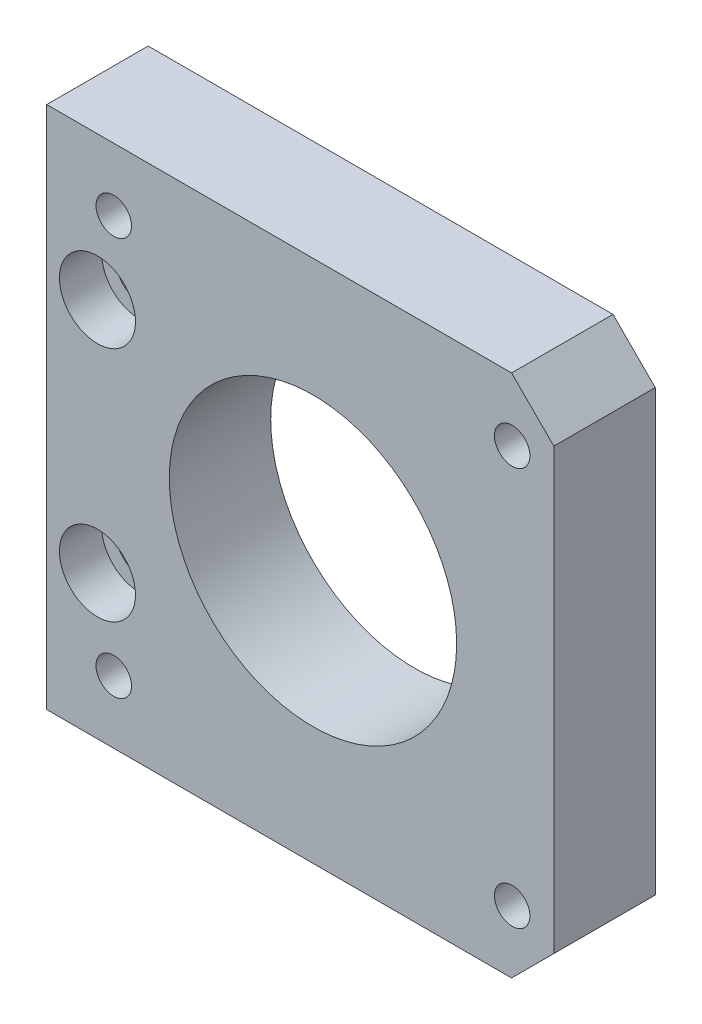
ISO-10303-21;
HEADER;
FILE_DESCRIPTION(('STEP AP214'),'2;1');
FILE_NAME('part.step','',(''),(''),'','','');
FILE_SCHEMA(('AUTOMOTIVE_DESIGN { 1 0 10303 214 1 1 1 1 }'));
ENDSEC;
DATA;
#1=APPLICATION_CONTEXT('core data for automotive mechanical design processes');
#2=APPLICATION_PROTOCOL_DEFINITION('international standard','automotive_design',2000,#1);
#3=PRODUCT_CONTEXT('',#1,'mechanical');
#4=PRODUCT('Part','Part','',(#3));
#5=PRODUCT_RELATED_PRODUCT_CATEGORY('part','',(#4));
#6=PRODUCT_DEFINITION_FORMATION('','',#4);
#7=PRODUCT_DEFINITION_CONTEXT('part definition',#1,'design');
#8=PRODUCT_DEFINITION('design','',#6,#7);
#9=PRODUCT_DEFINITION_SHAPE('','',#8);
#10=(LENGTH_UNIT() NAMED_UNIT(*) SI_UNIT(.MILLI.,.METRE.));
#11=(NAMED_UNIT(*) PLANE_ANGLE_UNIT() SI_UNIT($,.RADIAN.));
#12=(NAMED_UNIT(*) SI_UNIT($,.STERADIAN.) SOLID_ANGLE_UNIT());
#13=UNCERTAINTY_MEASURE_WITH_UNIT(LENGTH_MEASURE(1.E-05),#10,'distance_accuracy_value','');
#14=(GEOMETRIC_REPRESENTATION_CONTEXT(3) GLOBAL_UNCERTAINTY_ASSIGNED_CONTEXT((#13)) GLOBAL_UNIT_ASSIGNED_CONTEXT((#10,
#11,#12)) REPRESENTATION_CONTEXT('',''));
#15=CARTESIAN_POINT('',(0.,0.,0.));
#16=DIRECTION('',(0.,0.,1.));
#17=DIRECTION('',(1.,0.,0.));
#18=AXIS2_PLACEMENT_3D('',#15,#16,#17);
#19=CARTESIAN_POINT('',(0.,269.,12.));
#20=DIRECTION('',(1.,0.,0.));
#21=DIRECTION('',(0.,1.,0.));
#22=AXIS2_PLACEMENT_3D('',#19,#20,#21);
#23=PLANE('',#22);
#24=DIRECTION('',(0.,-1.,0.));
#25=VECTOR('',#24,1.);
#26=CARTESIAN_POINT('',(0.,269.,0.));
#27=LINE('',#26,#25);
#28=CARTESIAN_POINT('',(0.,331.,0.));
#29=VERTEX_POINT('',#28);
#30=CARTESIAN_POINT('',(0.,269.,0.));
#31=VERTEX_POINT('',#30);
#32=EDGE_CURVE('E105',#29,#31,#27,.T.);
#33=ORIENTED_EDGE('',*,*,#32,.T.);
#34=DIRECTION('',(0.,0.,-1.));
#35=VECTOR('',#34,1.);
#36=CARTESIAN_POINT('',(0.,269.,12.));
#37=LINE('',#36,#35);
#38=CARTESIAN_POINT('',(0.,269.,12.));
#39=VERTEX_POINT('',#38);
#40=EDGE_CURVE('E90',#39,#31,#37,.T.);
#41=ORIENTED_EDGE('',*,*,#40,.F.);
#42=DIRECTION('',(0.,-1.,0.));
#43=VECTOR('',#42,1.);
#44=CARTESIAN_POINT('',(0.,269.,12.));
#45=LINE('',#44,#43);
#46=CARTESIAN_POINT('',(0.,331.,12.));
#47=VERTEX_POINT('',#46);
#48=EDGE_CURVE('E94',#47,#39,#45,.T.);
#49=ORIENTED_EDGE('',*,*,#48,.F.);
#50=DIRECTION('',(0.,0.,-1.));
#51=VECTOR('',#50,1.);
#52=CARTESIAN_POINT('',(0.,331.,12.));
#53=LINE('',#52,#51);
#54=EDGE_CURVE('E107',#47,#29,#53,.T.);
#55=ORIENTED_EDGE('',*,*,#54,.T.);
#56=EDGE_LOOP('',(#33,#41,#49,#55));
#57=FACE_BOUND('',#56,.T.);
#58=ADVANCED_FACE('F33',(#57),#23,.F.);
#59=CARTESIAN_POINT('',(0.,269.,12.));
#60=DIRECTION('',(0.,1.,0.));
#61=DIRECTION('',(0.,0.,1.));
#62=AXIS2_PLACEMENT_3D('',#59,#60,#61);
#63=PLANE('',#62);
#64=DIRECTION('',(1.,0.,0.));
#65=VECTOR('',#64,1.);
#66=CARTESIAN_POINT('',(0.,269.,0.));
#67=LINE('',#66,#65);
#68=CARTESIAN_POINT('',(55.,269.,0.));
#69=VERTEX_POINT('',#68);
#70=EDGE_CURVE('E133',#31,#69,#67,.T.);
#71=ORIENTED_EDGE('',*,*,#70,.T.);
#72=DIRECTION('',(0.,0.,1.));
#73=VECTOR('',#72,1.);
#74=CARTESIAN_POINT('',(55.,269.,12.));
#75=LINE('',#74,#73);
#76=CARTESIAN_POINT('',(55.,269.,12.));
#77=VERTEX_POINT('',#76);
#78=EDGE_CURVE('E56',#69,#77,#75,.T.);
#79=ORIENTED_EDGE('',*,*,#78,.T.);
#80=DIRECTION('',(1.,0.,0.));
#81=VECTOR('',#80,1.);
#82=CARTESIAN_POINT('',(0.,269.,12.));
#83=LINE('',#82,#81);
#84=EDGE_CURVE('E86',#39,#77,#83,.T.);
#85=ORIENTED_EDGE('',*,*,#84,.F.);
#86=ORIENTED_EDGE('',*,*,#40,.T.);
#87=EDGE_LOOP('',(#71,#79,#85,#86));
#88=FACE_BOUND('',#87,.T.);
#89=ADVANCED_FACE('F88',(#88),#63,.F.);
#90=CARTESIAN_POINT('',(60.,269.,12.));
#91=DIRECTION('',(-1.,0.,0.));
#92=DIRECTION('',(0.,0.,1.));
#93=AXIS2_PLACEMENT_3D('',#90,#91,#92);
#94=PLANE('',#93);
#95=DIRECTION('',(0.,1.,0.));
#96=VECTOR('',#95,1.);
#97=CARTESIAN_POINT('',(60.,269.,12.));
#98=LINE('',#97,#96);
#99=CARTESIAN_POINT('',(60.,274.,12.));
#100=VERTEX_POINT('',#99);
#101=CARTESIAN_POINT('',(60.,326.,12.));
#102=VERTEX_POINT('',#101);
#103=EDGE_CURVE('E93',#100,#102,#98,.T.);
#104=ORIENTED_EDGE('',*,*,#103,.F.);
#105=DIRECTION('',(0.,0.,-1.));
#106=VECTOR('',#105,1.);
#107=CARTESIAN_POINT('',(60.,274.,12.));
#108=LINE('',#107,#106);
#109=CARTESIAN_POINT('',(60.,274.,0.));
#110=VERTEX_POINT('',#109);
#111=EDGE_CURVE('E109',#100,#110,#108,.T.);
#112=ORIENTED_EDGE('',*,*,#111,.T.);
#113=DIRECTION('',(0.,1.,0.));
#114=VECTOR('',#113,1.);
#115=CARTESIAN_POINT('',(60.,269.,0.));
#116=LINE('',#115,#114);
#117=CARTESIAN_POINT('',(60.,326.,0.));
#118=VERTEX_POINT('',#117);
#119=EDGE_CURVE('E134',#110,#118,#116,.T.);
#120=ORIENTED_EDGE('',*,*,#119,.T.);
#121=DIRECTION('',(0.,0.,1.));
#122=VECTOR('',#121,1.);
#123=CARTESIAN_POINT('',(60.,326.,12.));
#124=LINE('',#123,#122);
#125=EDGE_CURVE('E106',#118,#102,#124,.T.);
#126=ORIENTED_EDGE('',*,*,#125,.T.);
#127=EDGE_LOOP('',(#104,#112,#120,#126));
#128=FACE_BOUND('',#127,.T.);
#129=ADVANCED_FACE('F125',(#128),#94,.F.);
#130=CARTESIAN_POINT('',(0.,331.,12.));
#131=DIRECTION('',(0.,-1.,0.));
#132=DIRECTION('',(0.,0.,-1.));
#133=AXIS2_PLACEMENT_3D('',#130,#131,#132);
#134=PLANE('',#133);
#135=DIRECTION('',(-1.,0.,0.));
#136=VECTOR('',#135,1.);
#137=CARTESIAN_POINT('',(0.,331.,12.));
#138=LINE('',#137,#136);
#139=CARTESIAN_POINT('',(55.,331.,12.));
#140=VERTEX_POINT('',#139);
#141=EDGE_CURVE('E98',#140,#47,#138,.T.);
#142=ORIENTED_EDGE('',*,*,#141,.F.);
#143=DIRECTION('',(0.,0.,-1.));
#144=VECTOR('',#143,1.);
#145=CARTESIAN_POINT('',(55.,331.,12.));
#146=LINE('',#145,#144);
#147=CARTESIAN_POINT('',(55.,331.,0.));
#148=VERTEX_POINT('',#147);
#149=EDGE_CURVE('E11',#140,#148,#146,.T.);
#150=ORIENTED_EDGE('',*,*,#149,.T.);
#151=DIRECTION('',(-1.,0.,0.));
#152=VECTOR('',#151,1.);
#153=CARTESIAN_POINT('',(0.,331.,0.));
#154=LINE('',#153,#152);
#155=EDGE_CURVE('E102',#148,#29,#154,.T.);
#156=ORIENTED_EDGE('',*,*,#155,.T.);
#157=ORIENTED_EDGE('',*,*,#54,.F.);
#158=EDGE_LOOP('',(#142,#150,#156,#157));
#159=FACE_BOUND('',#158,.T.);
#160=ADVANCED_FACE('F142',(#159),#134,.F.);
#161=CARTESIAN_POINT('',(0.,0.,12.));
#162=DIRECTION('',(0.,0.,-1.));
#163=DIRECTION('',(-1.,0.,0.));
#164=AXIS2_PLACEMENT_3D('',#161,#162,#163);
#165=PLANE('',#164);
#166=CARTESIAN_POINT('',(55.07,323.57,12.));
#167=DIRECTION('',(0.,0.,1.));
#168=DIRECTION('',(1.,0.,0.));
#169=AXIS2_PLACEMENT_3D('',#166,#167,#168);
#170=CIRCLE('',#169,2.09999999999998);
#171=CARTESIAN_POINT('',(57.17,323.57,12.));
#172=VERTEX_POINT('',#171);
#173=EDGE_CURVE('E217',#172,#172,#170,.T.);
#174=ORIENTED_EDGE('',*,*,#173,.F.);
#175=EDGE_LOOP('',(#174));
#176=FACE_BOUND('',#175,.T.);
#177=CARTESIAN_POINT('',(55.07,276.43,12.));
#178=DIRECTION('',(0.,0.,1.));
#179=DIRECTION('',(1.,0.,0.));
#180=AXIS2_PLACEMENT_3D('',#177,#178,#179);
#181=CIRCLE('',#180,2.09999999999998);
#182=CARTESIAN_POINT('',(57.17,276.43,12.));
#183=VERTEX_POINT('',#182);
#184=EDGE_CURVE('E219',#183,#183,#181,.T.);
#185=ORIENTED_EDGE('',*,*,#184,.F.);
#186=EDGE_LOOP('',(#185));
#187=FACE_BOUND('',#186,.T.);
#188=CARTESIAN_POINT('',(7.93000000000001,323.57,12.));
#189=DIRECTION('',(0.,0.,1.));
#190=DIRECTION('',(1.,0.,0.));
#191=AXIS2_PLACEMENT_3D('',#188,#189,#190);
#192=CIRCLE('',#191,2.09999999999999);
#193=CARTESIAN_POINT('',(10.03,323.57,12.));
#194=VERTEX_POINT('',#193);
#195=EDGE_CURVE('E227',#194,#194,#192,.T.);
#196=ORIENTED_EDGE('',*,*,#195,.F.);
#197=EDGE_LOOP('',(#196));
#198=FACE_BOUND('',#197,.T.);
#199=CARTESIAN_POINT('',(7.93,276.43,12.));
#200=DIRECTION('',(0.,0.,1.));
#201=DIRECTION('',(1.,0.,0.));
#202=AXIS2_PLACEMENT_3D('',#199,#200,#201);
#203=CIRCLE('',#202,2.09999999999999);
#204=CARTESIAN_POINT('',(10.03,276.43,12.));
#205=VERTEX_POINT('',#204);
#206=EDGE_CURVE('E233',#205,#205,#203,.T.);
#207=ORIENTED_EDGE('',*,*,#206,.F.);
#208=EDGE_LOOP('',(#207));
#209=FACE_BOUND('',#208,.T.);
#210=CARTESIAN_POINT('',(6.,314.,12.));
#211=DIRECTION('',(0.,0.,1.));
#212=DIRECTION('',(1.,0.,0.));
#213=AXIS2_PLACEMENT_3D('',#210,#211,#212);
#214=CIRCLE('',#213,4.49999999999999);
#215=CARTESIAN_POINT('',(10.5,314.,12.));
#216=VERTEX_POINT('',#215);
#217=EDGE_CURVE('E239',#216,#216,#214,.T.);
#218=ORIENTED_EDGE('',*,*,#217,.F.);
#219=EDGE_LOOP('',(#218));
#220=FACE_BOUND('',#219,.T.);
#221=CARTESIAN_POINT('',(6.00000000000001,286.,12.));
#222=DIRECTION('',(0.,0.,1.));
#223=DIRECTION('',(1.,0.,0.));
#224=AXIS2_PLACEMENT_3D('',#221,#222,#223);
#225=CIRCLE('',#224,4.49999999999999);
#226=CARTESIAN_POINT('',(10.5,286.,12.));
#227=VERTEX_POINT('',#226);
#228=EDGE_CURVE('E251',#227,#227,#225,.T.);
#229=ORIENTED_EDGE('',*,*,#228,.F.);
#230=EDGE_LOOP('',(#229));
#231=FACE_BOUND('',#230,.T.);
#232=CARTESIAN_POINT('',(31.4999999999999,300.,12.));
#233=DIRECTION('',(0.,0.,1.));
#234=DIRECTION('',(1.,0.,0.));
#235=AXIS2_PLACEMENT_3D('',#232,#233,#234);
#236=CIRCLE('',#235,17.);
#237=CARTESIAN_POINT('',(48.4999999999999,300.,12.));
#238=VERTEX_POINT('',#237);
#239=EDGE_CURVE('E263',#238,#238,#236,.T.);
#240=ORIENTED_EDGE('',*,*,#239,.F.);
#241=EDGE_LOOP('',(#240));
#242=FACE_BOUND('',#241,.T.);
#243=ORIENTED_EDGE('',*,*,#84,.T.);
#244=DIRECTION('',(-0.707106781186548,-0.707106781186548,0.));
#245=VECTOR('',#244,1.);
#246=CARTESIAN_POINT('',(60.,274.,12.));
#247=LINE('',#246,#245);
#248=EDGE_CURVE('E41',#77,#100,#247,.F.);
#249=ORIENTED_EDGE('',*,*,#248,.T.);
#250=ORIENTED_EDGE('',*,*,#103,.T.);
#251=DIRECTION('',(0.707106781186548,-0.707106781186548,0.));
#252=VECTOR('',#251,1.);
#253=CARTESIAN_POINT('',(55.,331.,12.));
#254=LINE('',#253,#252);
#255=EDGE_CURVE('E48',#102,#140,#254,.F.);
#256=ORIENTED_EDGE('',*,*,#255,.T.);
#257=ORIENTED_EDGE('',*,*,#141,.T.);
#258=ORIENTED_EDGE('',*,*,#48,.T.);
#259=EDGE_LOOP('',(#243,#249,#250,#256,#257,#258));
#260=FACE_BOUND('',#259,.T.);
#261=ADVANCED_FACE('F97',(#176,#187,#198,#209,#220,#231,#242,#260),#165,.F.);
#262=CARTESIAN_POINT('',(0.,0.,0.));
#263=DIRECTION('',(0.,0.,-1.));
#264=DIRECTION('',(-1.,0.,0.));
#265=AXIS2_PLACEMENT_3D('',#262,#263,#264);
#266=PLANE('',#265);
#267=CARTESIAN_POINT('',(55.07,323.57,0.));
#268=DIRECTION('',(0.,0.,1.));
#269=DIRECTION('',(1.,0.,0.));
#270=AXIS2_PLACEMENT_3D('',#267,#268,#269);
#271=CIRCLE('',#270,2.1);
#272=CARTESIAN_POINT('',(57.17,323.57,0.));
#273=VERTEX_POINT('',#272);
#274=EDGE_CURVE('E214',#273,#273,#271,.T.);
#275=ORIENTED_EDGE('',*,*,#274,.T.);
#276=EDGE_LOOP('',(#275));
#277=FACE_BOUND('',#276,.T.);
#278=CARTESIAN_POINT('',(55.07,276.43,0.));
#279=DIRECTION('',(0.,0.,1.));
#280=DIRECTION('',(1.,0.,0.));
#281=AXIS2_PLACEMENT_3D('',#278,#279,#280);
#282=CIRCLE('',#281,2.1);
#283=CARTESIAN_POINT('',(57.17,276.43,0.));
#284=VERTEX_POINT('',#283);
#285=EDGE_CURVE('E224',#284,#284,#282,.T.);
#286=ORIENTED_EDGE('',*,*,#285,.T.);
#287=EDGE_LOOP('',(#286));
#288=FACE_BOUND('',#287,.T.);
#289=CARTESIAN_POINT('',(7.93000000000001,323.57,0.));
#290=DIRECTION('',(0.,0.,1.));
#291=DIRECTION('',(1.,0.,0.));
#292=AXIS2_PLACEMENT_3D('',#289,#290,#291);
#293=CIRCLE('',#292,2.1);
#294=CARTESIAN_POINT('',(10.03,323.57,0.));
#295=VERTEX_POINT('',#294);
#296=EDGE_CURVE('E230',#295,#295,#293,.T.);
#297=ORIENTED_EDGE('',*,*,#296,.T.);
#298=EDGE_LOOP('',(#297));
#299=FACE_BOUND('',#298,.T.);
#300=CARTESIAN_POINT('',(7.93,276.43,0.));
#301=DIRECTION('',(0.,0.,1.));
#302=DIRECTION('',(1.,0.,0.));
#303=AXIS2_PLACEMENT_3D('',#300,#301,#302);
#304=CIRCLE('',#303,2.1);
#305=CARTESIAN_POINT('',(10.03,276.43,0.));
#306=VERTEX_POINT('',#305);
#307=EDGE_CURVE('E236',#306,#306,#304,.T.);
#308=ORIENTED_EDGE('',*,*,#307,.T.);
#309=EDGE_LOOP('',(#308));
#310=FACE_BOUND('',#309,.T.);
#311=CARTESIAN_POINT('',(6.,314.,0.));
#312=DIRECTION('',(0.,0.,1.));
#313=DIRECTION('',(1.,0.,0.));
#314=AXIS2_PLACEMENT_3D('',#311,#312,#313);
#315=CIRCLE('',#314,2.75);
#316=CARTESIAN_POINT('',(8.75,314.,0.));
#317=VERTEX_POINT('',#316);
#318=EDGE_CURVE('E248',#317,#317,#315,.T.);
#319=ORIENTED_EDGE('',*,*,#318,.T.);
#320=EDGE_LOOP('',(#319));
#321=FACE_BOUND('',#320,.T.);
#322=CARTESIAN_POINT('',(6.00000000000001,286.,0.));
#323=DIRECTION('',(0.,0.,1.));
#324=DIRECTION('',(1.,0.,0.));
#325=AXIS2_PLACEMENT_3D('',#322,#323,#324);
#326=CIRCLE('',#325,2.75);
#327=CARTESIAN_POINT('',(8.75000000000001,286.,0.));
#328=VERTEX_POINT('',#327);
#329=EDGE_CURVE('E260',#328,#328,#326,.T.);
#330=ORIENTED_EDGE('',*,*,#329,.T.);
#331=EDGE_LOOP('',(#330));
#332=FACE_BOUND('',#331,.T.);
#333=CARTESIAN_POINT('',(31.4999999999999,300.,0.));
#334=DIRECTION('',(0.,0.,1.));
#335=DIRECTION('',(1.,0.,0.));
#336=AXIS2_PLACEMENT_3D('',#333,#334,#335);
#337=CIRCLE('',#336,17.);
#338=CARTESIAN_POINT('',(48.4999999999999,300.,0.));
#339=VERTEX_POINT('',#338);
#340=EDGE_CURVE('E137',#339,#339,#337,.T.);
#341=ORIENTED_EDGE('',*,*,#340,.T.);
#342=EDGE_LOOP('',(#341));
#343=FACE_BOUND('',#342,.T.);
#344=ORIENTED_EDGE('',*,*,#119,.F.);
#345=DIRECTION('',(0.707106781186548,0.707106781186548,0.));
#346=VECTOR('',#345,1.);
#347=CARTESIAN_POINT('',(-107.,107.,0.));
#348=LINE('',#347,#346);
#349=EDGE_CURVE('E118',#110,#69,#348,.F.);
#350=ORIENTED_EDGE('',*,*,#349,.T.);
#351=ORIENTED_EDGE('',*,*,#70,.F.);
#352=ORIENTED_EDGE('',*,*,#32,.F.);
#353=ORIENTED_EDGE('',*,*,#155,.F.);
#354=DIRECTION('',(-0.707106781186548,0.707106781186548,0.));
#355=VECTOR('',#354,1.);
#356=CARTESIAN_POINT('',(193.,193.,0.));
#357=LINE('',#356,#355);
#358=EDGE_CURVE('E116',#148,#118,#357,.F.);
#359=ORIENTED_EDGE('',*,*,#358,.T.);
#360=EDGE_LOOP('',(#344,#350,#351,#352,#353,#359));
#361=FACE_BOUND('',#360,.T.);
#362=ADVANCED_FACE('F132',(#277,#288,#299,#310,#321,#332,#343,#361),#266,.T.);
#363=CARTESIAN_POINT('',(31.4999999999999,300.,0.));
#364=DIRECTION('',(0.,0.,1.));
#365=DIRECTION('',(1.,0.,0.));
#366=AXIS2_PLACEMENT_3D('',#363,#364,#365);
#367=CYLINDRICAL_SURFACE('',#366,17.);
#368=ORIENTED_EDGE('',*,*,#340,.F.);
#369=EDGE_LOOP('',(#368));
#370=FACE_BOUND('',#369,.T.);
#371=ORIENTED_EDGE('',*,*,#239,.T.);
#372=EDGE_LOOP('',(#371));
#373=FACE_BOUND('',#372,.T.);
#374=ADVANCED_FACE('F163',(#370,#373),#367,.F.);
#375=CARTESIAN_POINT('',(6.00000000000001,286.,12.));
#376=DIRECTION('',(0.,0.,1.));
#377=DIRECTION('',(1.,0.,0.));
#378=AXIS2_PLACEMENT_3D('',#375,#376,#377);
#379=CYLINDRICAL_SURFACE('',#378,2.75);
#380=ORIENTED_EDGE('',*,*,#329,.F.);
#381=EDGE_LOOP('',(#380));
#382=FACE_BOUND('',#381,.T.);
#383=CARTESIAN_POINT('',(6.00000000000001,286.,7.));
#384=DIRECTION('',(0.,0.,1.));
#385=DIRECTION('',(1.,0.,0.));
#386=AXIS2_PLACEMENT_3D('',#383,#384,#385);
#387=CIRCLE('',#386,2.75);
#388=CARTESIAN_POINT('',(8.75000000000001,286.,7.));
#389=VERTEX_POINT('',#388);
#390=EDGE_CURVE('E257',#389,#389,#387,.T.);
#391=ORIENTED_EDGE('',*,*,#390,.T.);
#392=EDGE_LOOP('',(#391));
#393=FACE_BOUND('',#392,.T.);
#394=ADVANCED_FACE('F170',(#382,#393),#379,.F.);
#395=CARTESIAN_POINT('',(8.75000000000001,286.,7.));
#396=DIRECTION('',(0.,0.,-1.));
#397=DIRECTION('',(-1.,0.,0.));
#398=AXIS2_PLACEMENT_3D('',#395,#396,#397);
#399=PLANE('',#398);
#400=ORIENTED_EDGE('',*,*,#390,.F.);
#401=EDGE_LOOP('',(#400));
#402=FACE_BOUND('',#401,.T.);
#403=CARTESIAN_POINT('',(6.00000000000001,286.,7.));
#404=DIRECTION('',(0.,0.,1.));
#405=DIRECTION('',(1.,0.,0.));
#406=AXIS2_PLACEMENT_3D('',#403,#404,#405);
#407=CIRCLE('',#406,4.5);
#408=CARTESIAN_POINT('',(10.5,286.,7.));
#409=VERTEX_POINT('',#408);
#410=EDGE_CURVE('E254',#409,#409,#407,.T.);
#411=ORIENTED_EDGE('',*,*,#410,.T.);
#412=EDGE_LOOP('',(#411));
#413=FACE_BOUND('',#412,.T.);
#414=ADVANCED_FACE('F174',(#402,#413),#399,.F.);
#415=CARTESIAN_POINT('',(6.00000000000001,286.,12.));
#416=DIRECTION('',(0.,0.,1.));
#417=DIRECTION('',(1.,0.,0.));
#418=AXIS2_PLACEMENT_3D('',#415,#416,#417);
#419=CYLINDRICAL_SURFACE('',#418,4.49999999999999);
#420=ORIENTED_EDGE('',*,*,#410,.F.);
#421=EDGE_LOOP('',(#420));
#422=FACE_BOUND('',#421,.T.);
#423=ORIENTED_EDGE('',*,*,#228,.T.);
#424=EDGE_LOOP('',(#423));
#425=FACE_BOUND('',#424,.T.);
#426=ADVANCED_FACE('F178',(#422,#425),#419,.F.);
#427=CARTESIAN_POINT('',(6.,314.,12.));
#428=DIRECTION('',(0.,0.,1.));
#429=DIRECTION('',(1.,0.,0.));
#430=AXIS2_PLACEMENT_3D('',#427,#428,#429);
#431=CYLINDRICAL_SURFACE('',#430,2.75);
#432=ORIENTED_EDGE('',*,*,#318,.F.);
#433=EDGE_LOOP('',(#432));
#434=FACE_BOUND('',#433,.T.);
#435=CARTESIAN_POINT('',(6.,314.,7.));
#436=DIRECTION('',(0.,0.,1.));
#437=DIRECTION('',(1.,0.,0.));
#438=AXIS2_PLACEMENT_3D('',#435,#436,#437);
#439=CIRCLE('',#438,2.75);
#440=CARTESIAN_POINT('',(8.75000000000001,314.,7.));
#441=VERTEX_POINT('',#440);
#442=EDGE_CURVE('E245',#441,#441,#439,.T.);
#443=ORIENTED_EDGE('',*,*,#442,.T.);
#444=EDGE_LOOP('',(#443));
#445=FACE_BOUND('',#444,.T.);
#446=ADVANCED_FACE('F182',(#434,#445),#431,.F.);
#447=CARTESIAN_POINT('',(8.75000000000001,314.,7.));
#448=DIRECTION('',(0.,0.,-1.));
#449=DIRECTION('',(-1.,0.,0.));
#450=AXIS2_PLACEMENT_3D('',#447,#448,#449);
#451=PLANE('',#450);
#452=ORIENTED_EDGE('',*,*,#442,.F.);
#453=EDGE_LOOP('',(#452));
#454=FACE_BOUND('',#453,.T.);
#455=CARTESIAN_POINT('',(6.,314.,7.));
#456=DIRECTION('',(0.,0.,1.));
#457=DIRECTION('',(1.,0.,0.));
#458=AXIS2_PLACEMENT_3D('',#455,#456,#457);
#459=CIRCLE('',#458,4.5);
#460=CARTESIAN_POINT('',(10.5,314.,7.));
#461=VERTEX_POINT('',#460);
#462=EDGE_CURVE('E242',#461,#461,#459,.T.);
#463=ORIENTED_EDGE('',*,*,#462,.T.);
#464=EDGE_LOOP('',(#463));
#465=FACE_BOUND('',#464,.T.);
#466=ADVANCED_FACE('F186',(#454,#465),#451,.F.);
#467=CARTESIAN_POINT('',(6.,314.,12.));
#468=DIRECTION('',(0.,0.,1.));
#469=DIRECTION('',(1.,0.,0.));
#470=AXIS2_PLACEMENT_3D('',#467,#468,#469);
#471=CYLINDRICAL_SURFACE('',#470,4.5);
#472=ORIENTED_EDGE('',*,*,#462,.F.);
#473=EDGE_LOOP('',(#472));
#474=FACE_BOUND('',#473,.T.);
#475=ORIENTED_EDGE('',*,*,#217,.T.);
#476=EDGE_LOOP('',(#475));
#477=FACE_BOUND('',#476,.T.);
#478=ADVANCED_FACE('F190',(#474,#477),#471,.F.);
#479=CARTESIAN_POINT('',(7.93,276.43,12.));
#480=DIRECTION('',(0.,0.,1.));
#481=DIRECTION('',(1.,0.,0.));
#482=AXIS2_PLACEMENT_3D('',#479,#480,#481);
#483=CYLINDRICAL_SURFACE('',#482,2.09999999999999);
#484=ORIENTED_EDGE('',*,*,#307,.F.);
#485=EDGE_LOOP('',(#484));
#486=FACE_BOUND('',#485,.T.);
#487=ORIENTED_EDGE('',*,*,#206,.T.);
#488=EDGE_LOOP('',(#487));
#489=FACE_BOUND('',#488,.T.);
#490=ADVANCED_FACE('F194',(#486,#489),#483,.F.);
#491=CARTESIAN_POINT('',(7.93000000000001,323.57,12.));
#492=DIRECTION('',(0.,0.,1.));
#493=DIRECTION('',(1.,0.,0.));
#494=AXIS2_PLACEMENT_3D('',#491,#492,#493);
#495=CYLINDRICAL_SURFACE('',#494,2.09999999999999);
#496=ORIENTED_EDGE('',*,*,#296,.F.);
#497=EDGE_LOOP('',(#496));
#498=FACE_BOUND('',#497,.T.);
#499=ORIENTED_EDGE('',*,*,#195,.T.);
#500=EDGE_LOOP('',(#499));
#501=FACE_BOUND('',#500,.T.);
#502=ADVANCED_FACE('F198',(#498,#501),#495,.F.);
#503=CARTESIAN_POINT('',(55.07,276.43,12.));
#504=DIRECTION('',(0.,0.,1.));
#505=DIRECTION('',(1.,0.,0.));
#506=AXIS2_PLACEMENT_3D('',#503,#504,#505);
#507=CYLINDRICAL_SURFACE('',#506,2.09999999999999);
#508=ORIENTED_EDGE('',*,*,#285,.F.);
#509=EDGE_LOOP('',(#508));
#510=FACE_BOUND('',#509,.T.);
#511=ORIENTED_EDGE('',*,*,#184,.T.);
#512=EDGE_LOOP('',(#511));
#513=FACE_BOUND('',#512,.T.);
#514=ADVANCED_FACE('F202',(#510,#513),#507,.F.);
#515=CARTESIAN_POINT('',(55.07,323.57,12.));
#516=DIRECTION('',(0.,0.,1.));
#517=DIRECTION('',(1.,0.,0.));
#518=AXIS2_PLACEMENT_3D('',#515,#516,#517);
#519=CYLINDRICAL_SURFACE('',#518,2.09999999999999);
#520=ORIENTED_EDGE('',*,*,#274,.F.);
#521=EDGE_LOOP('',(#520));
#522=FACE_BOUND('',#521,.T.);
#523=ORIENTED_EDGE('',*,*,#173,.T.);
#524=EDGE_LOOP('',(#523));
#525=FACE_BOUND('',#524,.T.);
#526=ADVANCED_FACE('F149',(#522,#525),#519,.F.);
#527=CARTESIAN_POINT('',(60.,274.,12.));
#528=DIRECTION('',(-0.707106781186547,0.707106781186547,0.));
#529=DIRECTION('',(0.,0.,-1.));
#530=AXIS2_PLACEMENT_3D('',#527,#528,#529);
#531=PLANE('',#530);
#532=ORIENTED_EDGE('',*,*,#248,.F.);
#533=ORIENTED_EDGE('',*,*,#78,.F.);
#534=ORIENTED_EDGE('',*,*,#349,.F.);
#535=ORIENTED_EDGE('',*,*,#111,.F.);
#536=EDGE_LOOP('',(#532,#533,#534,#535));
#537=FACE_BOUND('',#536,.T.);
#538=ADVANCED_FACE('F130',(#537),#531,.F.);
#539=CARTESIAN_POINT('',(55.,331.,12.));
#540=DIRECTION('',(-0.707106781186547,-0.707106781186547,0.));
#541=DIRECTION('',(0.,0.,-1.));
#542=AXIS2_PLACEMENT_3D('',#539,#540,#541);
#543=PLANE('',#542);
#544=ORIENTED_EDGE('',*,*,#255,.F.);
#545=ORIENTED_EDGE('',*,*,#125,.F.);
#546=ORIENTED_EDGE('',*,*,#358,.F.);
#547=ORIENTED_EDGE('',*,*,#149,.F.);
#548=EDGE_LOOP('',(#544,#545,#546,#547));
#549=FACE_BOUND('',#548,.T.);
#550=ADVANCED_FACE('F35',(#549),#543,.F.);
#551=CLOSED_SHELL('',(#58,#89,#129,#160,#261,#362,#374,#394,#414,#426,#446,#466,#478,#490,#502,
#514,#526,#538,#550));
#552=MANIFOLD_SOLID_BREP('B2',#551);
#553=ADVANCED_BREP_SHAPE_REPRESENTATION('',(#18,#552),#14);
#554=SHAPE_DEFINITION_REPRESENTATION(#9,#553);
ENDSEC;
END-ISO-10303-21;
